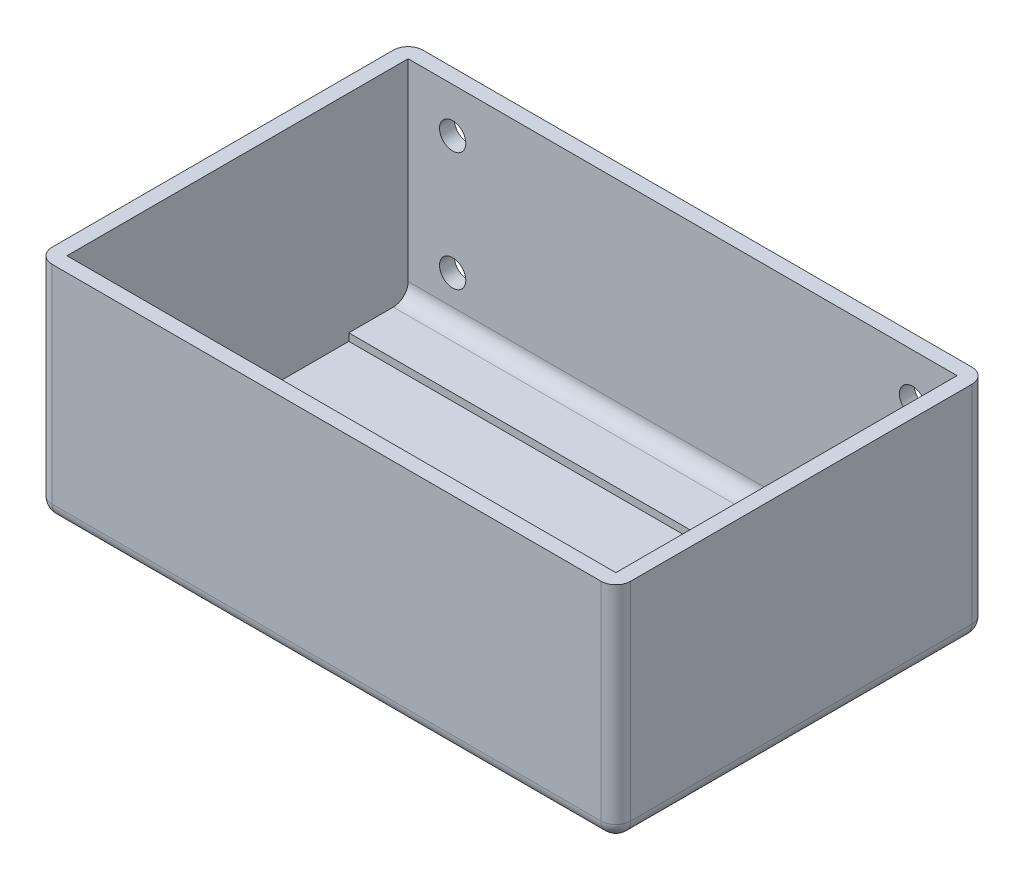
ISO-10303-21;
HEADER;
FILE_DESCRIPTION(('STEP AP214'),'2;1');
FILE_NAME('part.step','',(''),(''),'','','');
FILE_SCHEMA(('AUTOMOTIVE_DESIGN { 1 0 10303 214 1 1 1 1 }'));
ENDSEC;
DATA;
#1=APPLICATION_CONTEXT('core data for automotive mechanical design processes');
#2=APPLICATION_PROTOCOL_DEFINITION('international standard','automotive_design',2000,#1);
#3=PRODUCT_CONTEXT('',#1,'mechanical');
#4=PRODUCT('Part','Part','',(#3));
#5=PRODUCT_RELATED_PRODUCT_CATEGORY('part','',(#4));
#6=PRODUCT_DEFINITION_FORMATION('','',#4);
#7=PRODUCT_DEFINITION_CONTEXT('part definition',#1,'design');
#8=PRODUCT_DEFINITION('design','',#6,#7);
#9=PRODUCT_DEFINITION_SHAPE('','',#8);
#10=(LENGTH_UNIT() NAMED_UNIT(*) SI_UNIT(.MILLI.,.METRE.));
#11=(NAMED_UNIT(*) PLANE_ANGLE_UNIT() SI_UNIT($,.RADIAN.));
#12=(NAMED_UNIT(*) SI_UNIT($,.STERADIAN.) SOLID_ANGLE_UNIT());
#13=UNCERTAINTY_MEASURE_WITH_UNIT(LENGTH_MEASURE(1.E-05),#10,'distance_accuracy_value','');
#14=(GEOMETRIC_REPRESENTATION_CONTEXT(3) GLOBAL_UNCERTAINTY_ASSIGNED_CONTEXT((#13)) GLOBAL_UNIT_ASSIGNED_CONTEXT((#10,
#11,#12)) REPRESENTATION_CONTEXT('',''));
#15=CARTESIAN_POINT('',(0.,0.,0.));
#16=DIRECTION('',(0.,0.,1.));
#17=DIRECTION('',(1.,0.,0.));
#18=AXIS2_PLACEMENT_3D('',#15,#16,#17);
#19=CARTESIAN_POINT('',(48.26,38.1,29.21));
#20=DIRECTION('',(0.,0.,-1.));
#21=DIRECTION('',(0.,1.,0.));
#22=AXIS2_PLACEMENT_3D('',#19,#20,#21);
#23=PLANE('',#22);
#24=DIRECTION('',(0.,-1.,0.));
#25=VECTOR('',#24,1.);
#26=CARTESIAN_POINT('',(-45.72,38.1,29.21));
#27=LINE('',#26,#25);
#28=CARTESIAN_POINT('',(-45.72,38.1,29.21));
#29=VERTEX_POINT('',#28);
#30=CARTESIAN_POINT('',(-45.72,5.08,29.21));
#31=VERTEX_POINT('',#30);
#32=EDGE_CURVE('E493',#29,#31,#27,.T.);
#33=ORIENTED_EDGE('',*,*,#32,.F.);
#34=DIRECTION('',(-1.,0.,0.));
#35=VECTOR('',#34,1.);
#36=CARTESIAN_POINT('',(48.26,38.1,29.21));
#37=LINE('',#36,#35);
#38=CARTESIAN_POINT('',(48.26,38.1,29.21));
#39=VERTEX_POINT('',#38);
#40=EDGE_CURVE('E254',#39,#29,#37,.T.);
#41=ORIENTED_EDGE('',*,*,#40,.F.);
#42=DIRECTION('',(0.,-1.,0.));
#43=VECTOR('',#42,1.);
#44=CARTESIAN_POINT('',(48.26,38.1,29.21));
#45=LINE('',#44,#43);
#46=CARTESIAN_POINT('',(48.26,5.08,29.21));
#47=VERTEX_POINT('',#46);
#48=EDGE_CURVE('E395',#39,#47,#45,.T.);
#49=ORIENTED_EDGE('',*,*,#48,.T.);
#50=DIRECTION('',(-1.,0.,0.));
#51=VECTOR('',#50,1.);
#52=CARTESIAN_POINT('',(-48.26,5.07999999999999,29.21));
#53=LINE('',#52,#51);
#54=EDGE_CURVE('E258',#47,#31,#53,.T.);
#55=ORIENTED_EDGE('',*,*,#54,.T.);
#56=EDGE_LOOP('',(#33,#41,#49,#55));
#57=FACE_BOUND('',#56,.T.);
#58=ADVANCED_FACE('F47',(#57),#23,.T.);
#59=CARTESIAN_POINT('',(48.26,38.1,31.75));
#60=DIRECTION('',(0.,1.,0.));
#61=DIRECTION('',(0.,0.,1.));
#62=AXIS2_PLACEMENT_3D('',#59,#60,#61);
#63=PLANE('',#62);
#64=DIRECTION('',(-1.,0.,0.));
#65=VECTOR('',#64,1.);
#66=CARTESIAN_POINT('',(48.26,38.1,-29.21));
#67=LINE('',#66,#65);
#68=CARTESIAN_POINT('',(48.26,38.1,-29.21));
#69=VERTEX_POINT('',#68);
#70=CARTESIAN_POINT('',(-45.72,38.1,-29.21));
#71=VERTEX_POINT('',#70);
#72=EDGE_CURVE('E417',#69,#71,#67,.T.);
#73=ORIENTED_EDGE('',*,*,#72,.F.);
#74=DIRECTION('',(0.,0.,1.));
#75=VECTOR('',#74,1.);
#76=CARTESIAN_POINT('',(48.26,38.1,0.));
#77=LINE('',#76,#75);
#78=EDGE_CURVE('E536',#69,#39,#77,.T.);
#79=ORIENTED_EDGE('',*,*,#78,.T.);
#80=ORIENTED_EDGE('',*,*,#40,.T.);
#81=DIRECTION('',(0.,0.,-1.));
#82=VECTOR('',#81,1.);
#83=CARTESIAN_POINT('',(-45.72,38.1,0.));
#84=LINE('',#83,#82);
#85=EDGE_CURVE('E531',#29,#71,#84,.T.);
#86=ORIENTED_EDGE('',*,*,#85,.T.);
#87=EDGE_LOOP('',(#73,#79,#80,#86));
#88=FACE_BOUND('',#87,.T.);
#89=DIRECTION('',(-1.,0.,0.));
#90=VECTOR('',#89,1.);
#91=CARTESIAN_POINT('',(48.26,38.1,31.75));
#92=LINE('',#91,#90);
#93=CARTESIAN_POINT('',(48.26,38.1,31.75));
#94=VERTEX_POINT('',#93);
#95=CARTESIAN_POINT('',(-45.72,38.1,31.75));
#96=VERTEX_POINT('',#95);
#97=EDGE_CURVE('E411',#94,#96,#92,.T.);
#98=ORIENTED_EDGE('',*,*,#97,.F.);
#99=CARTESIAN_POINT('',(48.26,38.1,29.21));
#100=DIRECTION('',(0.,1.,0.));
#101=DIRECTION('',(0.,0.,1.));
#102=AXIS2_PLACEMENT_3D('',#99,#100,#101);
#103=CIRCLE('',#102,2.54);
#104=CARTESIAN_POINT('',(50.8,38.1,29.21));
#105=VERTEX_POINT('',#104);
#106=EDGE_CURVE('E342',#94,#105,#103,.T.);
#107=ORIENTED_EDGE('',*,*,#106,.T.);
#108=DIRECTION('',(0.,0.,1.));
#109=VECTOR('',#108,1.);
#110=CARTESIAN_POINT('',(50.8,38.1,0.));
#111=LINE('',#110,#109);
#112=CARTESIAN_POINT('',(50.8,38.1,-29.21));
#113=VERTEX_POINT('',#112);
#114=EDGE_CURVE('E535',#113,#105,#111,.T.);
#115=ORIENTED_EDGE('',*,*,#114,.F.);
#116=CARTESIAN_POINT('',(48.26,38.1,-29.21));
#117=DIRECTION('',(0.,1.,0.));
#118=DIRECTION('',(0.,0.,1.));
#119=AXIS2_PLACEMENT_3D('',#116,#117,#118);
#120=CIRCLE('',#119,2.54);
#121=CARTESIAN_POINT('',(48.26,38.1,-31.75));
#122=VERTEX_POINT('',#121);
#123=EDGE_CURVE('E71',#113,#122,#120,.T.);
#124=ORIENTED_EDGE('',*,*,#123,.T.);
#125=DIRECTION('',(-1.,0.,0.));
#126=VECTOR('',#125,1.);
#127=CARTESIAN_POINT('',(48.26,38.1,-31.75));
#128=LINE('',#127,#126);
#129=CARTESIAN_POINT('',(-45.72,38.1,-31.75));
#130=VERTEX_POINT('',#129);
#131=EDGE_CURVE('E390',#122,#130,#128,.T.);
#132=ORIENTED_EDGE('',*,*,#131,.T.);
#133=CARTESIAN_POINT('',(-45.72,38.1,-29.21));
#134=DIRECTION('',(0.,1.,0.));
#135=DIRECTION('',(0.,0.,1.));
#136=AXIS2_PLACEMENT_3D('',#133,#134,#135);
#137=CIRCLE('',#136,2.54);
#138=CARTESIAN_POINT('',(-48.26,38.1,-29.21));
#139=VERTEX_POINT('',#138);
#140=EDGE_CURVE('E334',#130,#139,#137,.T.);
#141=ORIENTED_EDGE('',*,*,#140,.T.);
#142=DIRECTION('',(0.,0.,-1.));
#143=VECTOR('',#142,1.);
#144=CARTESIAN_POINT('',(-48.26,38.1,31.75));
#145=LINE('',#144,#143);
#146=CARTESIAN_POINT('',(-48.26,38.1,29.21));
#147=VERTEX_POINT('',#146);
#148=EDGE_CURVE('E388',#147,#139,#145,.T.);
#149=ORIENTED_EDGE('',*,*,#148,.F.);
#150=CARTESIAN_POINT('',(-45.72,38.1,29.21));
#151=DIRECTION('',(0.,1.,0.));
#152=DIRECTION('',(0.,0.,1.));
#153=AXIS2_PLACEMENT_3D('',#150,#151,#152);
#154=CIRCLE('',#153,2.54);
#155=EDGE_CURVE('E337',#147,#96,#154,.T.);
#156=ORIENTED_EDGE('',*,*,#155,.T.);
#157=EDGE_LOOP('',(#98,#107,#115,#124,#132,#141,#149,#156));
#158=FACE_BOUND('',#157,.T.);
#159=ADVANCED_FACE('F387',(#88,#158),#63,.T.);
#160=CARTESIAN_POINT('',(48.26,0.,31.75));
#161=DIRECTION('',(0.,0.,1.));
#162=DIRECTION('',(1.,0.,0.));
#163=AXIS2_PLACEMENT_3D('',#160,#161,#162);
#164=PLANE('',#163);
#165=DIRECTION('',(-1.,0.,0.));
#166=VECTOR('',#165,1.);
#167=CARTESIAN_POINT('',(48.26,2.53999999999999,31.75));
#168=LINE('',#167,#166);
#169=CARTESIAN_POINT('',(-45.72,2.53999999999999,31.75));
#170=VERTEX_POINT('',#169);
#171=CARTESIAN_POINT('',(48.26,2.53999999999999,31.75));
#172=VERTEX_POINT('',#171);
#173=EDGE_CURVE('E281',#170,#172,#168,.F.);
#174=ORIENTED_EDGE('',*,*,#173,.T.);
#175=DIRECTION('',(0.,1.,0.));
#176=VECTOR('',#175,1.);
#177=CARTESIAN_POINT('',(48.26,0.,31.75));
#178=LINE('',#177,#176);
#179=EDGE_CURVE('E331',#172,#94,#178,.T.);
#180=ORIENTED_EDGE('',*,*,#179,.T.);
#181=ORIENTED_EDGE('',*,*,#97,.T.);
#182=DIRECTION('',(0.,1.,0.));
#183=VECTOR('',#182,1.);
#184=CARTESIAN_POINT('',(-45.72,2.53999999999999,31.75));
#185=LINE('',#184,#183);
#186=EDGE_CURVE('E328',#96,#170,#185,.F.);
#187=ORIENTED_EDGE('',*,*,#186,.T.);
#188=EDGE_LOOP('',(#174,#180,#181,#187));
#189=FACE_BOUND('',#188,.T.);
#190=ADVANCED_FACE('F603',(#189),#164,.T.);
#191=CARTESIAN_POINT('',(48.26,0.,-31.75));
#192=DIRECTION('',(0.,-1.,0.));
#193=DIRECTION('',(0.,0.,-1.));
#194=AXIS2_PLACEMENT_3D('',#191,#192,#193);
#195=PLANE('',#194);
#196=DIRECTION('',(-1.,0.,0.));
#197=VECTOR('',#196,1.);
#198=CARTESIAN_POINT('',(48.26,0.,-29.21));
#199=LINE('',#198,#197);
#200=CARTESIAN_POINT('',(-45.72,0.,-29.21));
#201=VERTEX_POINT('',#200);
#202=CARTESIAN_POINT('',(48.26,0.,-29.21));
#203=VERTEX_POINT('',#202);
#204=EDGE_CURVE('E277',#201,#203,#199,.F.);
#205=ORIENTED_EDGE('',*,*,#204,.T.);
#206=DIRECTION('',(0.,0.,-1.));
#207=VECTOR('',#206,1.);
#208=CARTESIAN_POINT('',(48.26,0.,-31.75));
#209=LINE('',#208,#207);
#210=CARTESIAN_POINT('',(48.26,0.,29.21));
#211=VERTEX_POINT('',#210);
#212=EDGE_CURVE('E310',#203,#211,#209,.F.);
#213=ORIENTED_EDGE('',*,*,#212,.T.);
#214=DIRECTION('',(-1.,0.,0.));
#215=VECTOR('',#214,1.);
#216=CARTESIAN_POINT('',(48.26,0.,29.21));
#217=LINE('',#216,#215);
#218=CARTESIAN_POINT('',(-45.72,0.,29.21));
#219=VERTEX_POINT('',#218);
#220=EDGE_CURVE('E273',#211,#219,#217,.T.);
#221=ORIENTED_EDGE('',*,*,#220,.T.);
#222=DIRECTION('',(0.,0.,1.));
#223=VECTOR('',#222,1.);
#224=CARTESIAN_POINT('',(-45.72,0.,-29.21));
#225=LINE('',#224,#223);
#226=EDGE_CURVE('E307',#219,#201,#225,.F.);
#227=ORIENTED_EDGE('',*,*,#226,.T.);
#228=EDGE_LOOP('',(#205,#213,#221,#227));
#229=FACE_BOUND('',#228,.T.);
#230=ADVANCED_FACE('F811',(#229),#195,.T.);
#231=CARTESIAN_POINT('',(48.26,0.,-31.75));
#232=DIRECTION('',(0.,0.,1.));
#233=DIRECTION('',(0.,-1.,0.));
#234=AXIS2_PLACEMENT_3D('',#231,#232,#233);
#235=PLANE('',#234);
#236=CARTESIAN_POINT('',(-38.1,30.48,-31.75));
#237=DIRECTION('',(0.,0.,1.));
#238=DIRECTION('',(1.,0.,0.));
#239=AXIS2_PLACEMENT_3D('',#236,#237,#238);
#240=CIRCLE('',#239,2.25);
#241=CARTESIAN_POINT('',(-35.85,30.48,-31.75));
#242=VERTEX_POINT('',#241);
#243=EDGE_CURVE('E561',#242,#242,#240,.T.);
#244=ORIENTED_EDGE('',*,*,#243,.T.);
#245=EDGE_LOOP('',(#244));
#246=FACE_BOUND('',#245,.T.);
#247=CARTESIAN_POINT('',(40.64,30.48,-31.75));
#248=DIRECTION('',(0.,0.,1.));
#249=DIRECTION('',(1.,0.,0.));
#250=AXIS2_PLACEMENT_3D('',#247,#248,#249);
#251=CIRCLE('',#250,2.25);
#252=CARTESIAN_POINT('',(42.89,30.48,-31.75));
#253=VERTEX_POINT('',#252);
#254=EDGE_CURVE('E553',#253,#253,#251,.T.);
#255=ORIENTED_EDGE('',*,*,#254,.T.);
#256=EDGE_LOOP('',(#255));
#257=FACE_BOUND('',#256,.T.);
#258=CARTESIAN_POINT('',(-38.1,10.16,-31.75));
#259=DIRECTION('',(0.,0.,1.));
#260=DIRECTION('',(1.,0.,0.));
#261=AXIS2_PLACEMENT_3D('',#258,#259,#260);
#262=CIRCLE('',#261,2.25);
#263=CARTESIAN_POINT('',(-35.85,10.16,-31.75));
#264=VERTEX_POINT('',#263);
#265=EDGE_CURVE('E366',#264,#264,#262,.T.);
#266=ORIENTED_EDGE('',*,*,#265,.T.);
#267=EDGE_LOOP('',(#266));
#268=FACE_BOUND('',#267,.T.);
#269=CARTESIAN_POINT('',(40.64,10.16,-31.75));
#270=DIRECTION('',(0.,0.,1.));
#271=DIRECTION('',(0.,-1.,0.));
#272=AXIS2_PLACEMENT_3D('',#269,#270,#271);
#273=CIRCLE('',#272,6.35);
#274=CARTESIAN_POINT('',(40.64,3.81,-31.75));
#275=VERTEX_POINT('',#274);
#276=EDGE_CURVE('E237',#275,#275,#273,.T.);
#277=ORIENTED_EDGE('',*,*,#276,.T.);
#278=EDGE_LOOP('',(#277));
#279=FACE_BOUND('',#278,.T.);
#280=ORIENTED_EDGE('',*,*,#131,.F.);
#281=DIRECTION('',(0.,1.,0.));
#282=VECTOR('',#281,1.);
#283=CARTESIAN_POINT('',(48.26,2.54,-31.75));
#284=LINE('',#283,#282);
#285=CARTESIAN_POINT('',(48.26,2.54,-31.75));
#286=VERTEX_POINT('',#285);
#287=EDGE_CURVE('E11',#122,#286,#284,.F.);
#288=ORIENTED_EDGE('',*,*,#287,.T.);
#289=DIRECTION('',(-1.,0.,0.));
#290=VECTOR('',#289,1.);
#291=CARTESIAN_POINT('',(-48.26,2.54,-31.75));
#292=LINE('',#291,#290);
#293=CARTESIAN_POINT('',(-45.72,2.54,-31.75));
#294=VERTEX_POINT('',#293);
#295=EDGE_CURVE('E268',#286,#294,#292,.T.);
#296=ORIENTED_EDGE('',*,*,#295,.T.);
#297=DIRECTION('',(0.,1.,0.));
#298=VECTOR('',#297,1.);
#299=CARTESIAN_POINT('',(-45.72,0.,-31.75));
#300=LINE('',#299,#298);
#301=EDGE_CURVE('E57',#294,#130,#300,.T.);
#302=ORIENTED_EDGE('',*,*,#301,.T.);
#303=EDGE_LOOP('',(#280,#288,#296,#302));
#304=FACE_BOUND('',#303,.T.);
#305=ADVANCED_FACE('F575',(#246,#257,#268,#279,#304),#235,.F.);
#306=CARTESIAN_POINT('',(48.26,38.1,-29.21));
#307=DIRECTION('',(0.,0.,-1.));
#308=DIRECTION('',(0.,1.,0.));
#309=AXIS2_PLACEMENT_3D('',#306,#307,#308);
#310=PLANE('',#309);
#311=CARTESIAN_POINT('',(-38.1,30.48,-29.21));
#312=DIRECTION('',(0.,0.,1.));
#313=DIRECTION('',(1.,0.,0.));
#314=AXIS2_PLACEMENT_3D('',#311,#312,#313);
#315=CIRCLE('',#314,2.25);
#316=CARTESIAN_POINT('',(-35.85,30.48,-29.21));
#317=VERTEX_POINT('',#316);
#318=EDGE_CURVE('E565',#317,#317,#315,.T.);
#319=ORIENTED_EDGE('',*,*,#318,.F.);
#320=EDGE_LOOP('',(#319));
#321=FACE_BOUND('',#320,.T.);
#322=CARTESIAN_POINT('',(40.64,30.48,-29.21));
#323=DIRECTION('',(0.,0.,1.));
#324=DIRECTION('',(1.,0.,0.));
#325=AXIS2_PLACEMENT_3D('',#322,#323,#324);
#326=CIRCLE('',#325,2.25);
#327=CARTESIAN_POINT('',(42.89,30.48,-29.21));
#328=VERTEX_POINT('',#327);
#329=EDGE_CURVE('E557',#328,#328,#326,.T.);
#330=ORIENTED_EDGE('',*,*,#329,.F.);
#331=EDGE_LOOP('',(#330));
#332=FACE_BOUND('',#331,.T.);
#333=CARTESIAN_POINT('',(-38.1,10.16,-29.21));
#334=DIRECTION('',(0.,0.,1.));
#335=DIRECTION('',(1.,0.,0.));
#336=AXIS2_PLACEMENT_3D('',#333,#334,#335);
#337=CIRCLE('',#336,2.25);
#338=CARTESIAN_POINT('',(-35.85,10.16,-29.21));
#339=VERTEX_POINT('',#338);
#340=EDGE_CURVE('E549',#339,#339,#337,.T.);
#341=ORIENTED_EDGE('',*,*,#340,.F.);
#342=EDGE_LOOP('',(#341));
#343=FACE_BOUND('',#342,.T.);
#344=CARTESIAN_POINT('',(40.64,10.16,-29.21));
#345=DIRECTION('',(0.,0.,-1.));
#346=DIRECTION('',(0.,1.,0.));
#347=AXIS2_PLACEMENT_3D('',#344,#345,#346);
#348=CIRCLE('',#347,6.35);
#349=CARTESIAN_POINT('',(36.83,5.08,-29.21));
#350=VERTEX_POINT('',#349);
#351=CARTESIAN_POINT('',(44.45,5.08,-29.21));
#352=VERTEX_POINT('',#351);
#353=EDGE_CURVE('E235',#350,#352,#348,.T.);
#354=ORIENTED_EDGE('',*,*,#353,.T.);
#355=DIRECTION('',(-1.,0.,0.));
#356=VECTOR('',#355,1.);
#357=CARTESIAN_POINT('',(48.26,5.08,-29.21));
#358=LINE('',#357,#356);
#359=CARTESIAN_POINT('',(48.26,5.08000000000001,-29.21));
#360=VERTEX_POINT('',#359);
#361=EDGE_CURVE('E230',#352,#360,#358,.F.);
#362=ORIENTED_EDGE('',*,*,#361,.T.);
#363=DIRECTION('',(0.,-1.,0.));
#364=VECTOR('',#363,1.);
#365=CARTESIAN_POINT('',(48.26,38.1,-29.21));
#366=LINE('',#365,#364);
#367=EDGE_CURVE('E406',#69,#360,#366,.T.);
#368=ORIENTED_EDGE('',*,*,#367,.F.);
#369=ORIENTED_EDGE('',*,*,#72,.T.);
#370=DIRECTION('',(0.,-1.,0.));
#371=VECTOR('',#370,1.);
#372=CARTESIAN_POINT('',(-45.72,38.1,-29.21));
#373=LINE('',#372,#371);
#374=CARTESIAN_POINT('',(-45.72,5.08,-29.21));
#375=VERTEX_POINT('',#374);
#376=EDGE_CURVE('E396',#71,#375,#373,.T.);
#377=ORIENTED_EDGE('',*,*,#376,.T.);
#378=EDGE_CURVE('E229',#375,#350,#358,.F.);
#379=ORIENTED_EDGE('',*,*,#378,.T.);
#380=EDGE_LOOP('',(#354,#362,#368,#369,#377,#379));
#381=FACE_BOUND('',#380,.T.);
#382=ADVANCED_FACE('F240',(#321,#332,#343,#381),#310,.F.);
#383=CARTESIAN_POINT('',(48.26,2.54,-29.21));
#384=DIRECTION('',(0.,-1.,0.));
#385=DIRECTION('',(0.,0.,-1.));
#386=AXIS2_PLACEMENT_3D('',#383,#384,#385);
#387=PLANE('',#386);
#388=DIRECTION('',(-1.,0.,0.));
#389=VECTOR('',#388,1.);
#390=CARTESIAN_POINT('',(-48.26,2.54,-26.67));
#391=LINE('',#390,#389);
#392=CARTESIAN_POINT('',(48.26,2.54,-26.67));
#393=VERTEX_POINT('',#392);
#394=CARTESIAN_POINT('',(-45.72,2.54,-26.67));
#395=VERTEX_POINT('',#394);
#396=EDGE_CURVE('E251',#393,#395,#391,.T.);
#397=ORIENTED_EDGE('',*,*,#396,.T.);
#398=DIRECTION('',(0.,0.,1.));
#399=VECTOR('',#398,1.);
#400=CARTESIAN_POINT('',(-45.72,2.54,-29.21));
#401=LINE('',#400,#399);
#402=CARTESIAN_POINT('',(-45.72,2.54,-19.05));
#403=VERTEX_POINT('',#402);
#404=EDGE_CURVE('E496',#395,#403,#401,.T.);
#405=ORIENTED_EDGE('',*,*,#404,.T.);
#406=DIRECTION('',(-1.,0.,0.));
#407=VECTOR('',#406,1.);
#408=CARTESIAN_POINT('',(48.26,2.54,-19.05));
#409=LINE('',#408,#407);
#410=CARTESIAN_POINT('',(48.26,2.54,-19.05));
#411=VERTEX_POINT('',#410);
#412=EDGE_CURVE('E421',#411,#403,#409,.T.);
#413=ORIENTED_EDGE('',*,*,#412,.F.);
#414=DIRECTION('',(0.,0.,1.));
#415=VECTOR('',#414,1.);
#416=CARTESIAN_POINT('',(48.26,2.54,-29.21));
#417=LINE('',#416,#415);
#418=EDGE_CURVE('E457',#393,#411,#417,.T.);
#419=ORIENTED_EDGE('',*,*,#418,.F.);
#420=EDGE_LOOP('',(#397,#405,#413,#419));
#421=FACE_BOUND('',#420,.T.);
#422=ADVANCED_FACE('F574',(#421),#387,.F.);
#423=CARTESIAN_POINT('',(48.26,2.54,-19.05));
#424=DIRECTION('',(0.,0.,-1.));
#425=DIRECTION('',(-1.,0.,0.));
#426=AXIS2_PLACEMENT_3D('',#423,#424,#425);
#427=PLANE('',#426);
#428=ORIENTED_EDGE('',*,*,#412,.T.);
#429=DIRECTION('',(0.,-1.,0.));
#430=VECTOR('',#429,1.);
#431=CARTESIAN_POINT('',(-45.72,2.54,-19.05));
#432=LINE('',#431,#430);
#433=CARTESIAN_POINT('',(-45.72,1.27,-19.05));
#434=VERTEX_POINT('',#433);
#435=EDGE_CURVE('E500',#403,#434,#432,.T.);
#436=ORIENTED_EDGE('',*,*,#435,.T.);
#437=DIRECTION('',(-1.,0.,0.));
#438=VECTOR('',#437,1.);
#439=CARTESIAN_POINT('',(48.26,1.27,-19.05));
#440=LINE('',#439,#438);
#441=CARTESIAN_POINT('',(48.26,1.27,-19.05));
#442=VERTEX_POINT('',#441);
#443=EDGE_CURVE('E425',#442,#434,#440,.T.);
#444=ORIENTED_EDGE('',*,*,#443,.F.);
#445=DIRECTION('',(0.,-1.,0.));
#446=VECTOR('',#445,1.);
#447=CARTESIAN_POINT('',(48.26,2.54,-19.05));
#448=LINE('',#447,#446);
#449=EDGE_CURVE('E460',#411,#442,#448,.T.);
#450=ORIENTED_EDGE('',*,*,#449,.F.);
#451=EDGE_LOOP('',(#428,#436,#444,#450));
#452=FACE_BOUND('',#451,.T.);
#453=ADVANCED_FACE('F785',(#452),#427,.F.);
#454=CARTESIAN_POINT('',(48.26,1.27,-19.05));
#455=DIRECTION('',(0.,-1.,0.));
#456=DIRECTION('',(0.,0.,-1.));
#457=AXIS2_PLACEMENT_3D('',#454,#455,#456);
#458=PLANE('',#457);
#459=ORIENTED_EDGE('',*,*,#443,.T.);
#460=DIRECTION('',(0.,0.,1.));
#461=VECTOR('',#460,1.);
#462=CARTESIAN_POINT('',(-45.72,1.27,-19.05));
#463=LINE('',#462,#461);
#464=CARTESIAN_POINT('',(-45.72,1.26999999999999,-6.35));
#465=VERTEX_POINT('',#464);
#466=EDGE_CURVE('E504',#434,#465,#463,.T.);
#467=ORIENTED_EDGE('',*,*,#466,.T.);
#468=DIRECTION('',(-1.,0.,0.));
#469=VECTOR('',#468,1.);
#470=CARTESIAN_POINT('',(48.26,1.26999999999999,-6.35));
#471=LINE('',#470,#469);
#472=CARTESIAN_POINT('',(48.26,1.26999999999999,-6.35));
#473=VERTEX_POINT('',#472);
#474=EDGE_CURVE('E429',#473,#465,#471,.T.);
#475=ORIENTED_EDGE('',*,*,#474,.F.);
#476=DIRECTION('',(0.,0.,1.));
#477=VECTOR('',#476,1.);
#478=CARTESIAN_POINT('',(48.26,1.27,-19.05));
#479=LINE('',#478,#477);
#480=EDGE_CURVE('E464',#442,#473,#479,.T.);
#481=ORIENTED_EDGE('',*,*,#480,.F.);
#482=EDGE_LOOP('',(#459,#467,#475,#481));
#483=FACE_BOUND('',#482,.T.);
#484=ADVANCED_FACE('F777',(#483),#458,.F.);
#485=CARTESIAN_POINT('',(48.26,1.26999999999999,-6.35));
#486=DIRECTION('',(0.,0.,1.));
#487=DIRECTION('',(0.,-1.,0.));
#488=AXIS2_PLACEMENT_3D('',#485,#486,#487);
#489=PLANE('',#488);
#490=ORIENTED_EDGE('',*,*,#474,.T.);
#491=DIRECTION('',(0.,1.,0.));
#492=VECTOR('',#491,1.);
#493=CARTESIAN_POINT('',(-45.72,1.26999999999999,-6.35));
#494=LINE('',#493,#492);
#495=CARTESIAN_POINT('',(-45.72,2.54,-6.35));
#496=VERTEX_POINT('',#495);
#497=EDGE_CURVE('E508',#465,#496,#494,.T.);
#498=ORIENTED_EDGE('',*,*,#497,.T.);
#499=DIRECTION('',(-1.,0.,0.));
#500=VECTOR('',#499,1.);
#501=CARTESIAN_POINT('',(48.26,2.54,-6.35));
#502=LINE('',#501,#500);
#503=CARTESIAN_POINT('',(48.26,2.54,-6.35));
#504=VERTEX_POINT('',#503);
#505=EDGE_CURVE('E433',#504,#496,#502,.T.);
#506=ORIENTED_EDGE('',*,*,#505,.F.);
#507=DIRECTION('',(0.,1.,0.));
#508=VECTOR('',#507,1.);
#509=CARTESIAN_POINT('',(48.26,1.26999999999999,-6.35));
#510=LINE('',#509,#508);
#511=EDGE_CURVE('E469',#473,#504,#510,.T.);
#512=ORIENTED_EDGE('',*,*,#511,.F.);
#513=EDGE_LOOP('',(#490,#498,#506,#512));
#514=FACE_BOUND('',#513,.T.);
#515=ADVANCED_FACE('F769',(#514),#489,.F.);
#516=CARTESIAN_POINT('',(48.26,2.53999999999999,6.35));
#517=DIRECTION('',(0.,1.,0.));
#518=DIRECTION('',(0.,0.,1.));
#519=AXIS2_PLACEMENT_3D('',#516,#517,#518);
#520=PLANE('',#519);
#521=DIRECTION('',(0.,0.,-1.));
#522=VECTOR('',#521,1.);
#523=CARTESIAN_POINT('',(-45.72,2.53999999999999,6.35));
#524=LINE('',#523,#522);
#525=CARTESIAN_POINT('',(-45.72,2.53999999999999,6.35));
#526=VERTEX_POINT('',#525);
#527=EDGE_CURVE('E512',#526,#496,#524,.T.);
#528=ORIENTED_EDGE('',*,*,#527,.F.);
#529=DIRECTION('',(-1.,0.,0.));
#530=VECTOR('',#529,1.);
#531=CARTESIAN_POINT('',(48.26,2.53999999999999,6.35));
#532=LINE('',#531,#530);
#533=CARTESIAN_POINT('',(48.26,2.53999999999999,6.35));
#534=VERTEX_POINT('',#533);
#535=EDGE_CURVE('E437',#534,#526,#532,.T.);
#536=ORIENTED_EDGE('',*,*,#535,.F.);
#537=DIRECTION('',(0.,0.,-1.));
#538=VECTOR('',#537,1.);
#539=CARTESIAN_POINT('',(48.26,2.53999999999999,6.35));
#540=LINE('',#539,#538);
#541=EDGE_CURVE('E472',#534,#504,#540,.T.);
#542=ORIENTED_EDGE('',*,*,#541,.T.);
#543=ORIENTED_EDGE('',*,*,#505,.T.);
#544=EDGE_LOOP('',(#528,#536,#542,#543));
#545=FACE_BOUND('',#544,.T.);
#546=ADVANCED_FACE('F761',(#545),#520,.T.);
#547=CARTESIAN_POINT('',(48.26,1.26999999999999,6.35));
#548=DIRECTION('',(0.,0.,1.));
#549=DIRECTION('',(0.,-1.,0.));
#550=AXIS2_PLACEMENT_3D('',#547,#548,#549);
#551=PLANE('',#550);
#552=DIRECTION('',(0.,1.,0.));
#553=VECTOR('',#552,1.);
#554=CARTESIAN_POINT('',(-45.72,1.26999999999999,6.35));
#555=LINE('',#554,#553);
#556=CARTESIAN_POINT('',(-45.72,1.26999999999999,6.35));
#557=VERTEX_POINT('',#556);
#558=EDGE_CURVE('E515',#557,#526,#555,.T.);
#559=ORIENTED_EDGE('',*,*,#558,.F.);
#560=DIRECTION('',(-1.,0.,0.));
#561=VECTOR('',#560,1.);
#562=CARTESIAN_POINT('',(48.26,1.26999999999999,6.35));
#563=LINE('',#562,#561);
#564=CARTESIAN_POINT('',(48.26,1.26999999999999,6.35));
#565=VERTEX_POINT('',#564);
#566=EDGE_CURVE('E441',#565,#557,#563,.T.);
#567=ORIENTED_EDGE('',*,*,#566,.F.);
#568=DIRECTION('',(0.,1.,0.));
#569=VECTOR('',#568,1.);
#570=CARTESIAN_POINT('',(48.26,1.26999999999999,6.35));
#571=LINE('',#570,#569);
#572=EDGE_CURVE('E476',#565,#534,#571,.T.);
#573=ORIENTED_EDGE('',*,*,#572,.T.);
#574=ORIENTED_EDGE('',*,*,#535,.T.);
#575=EDGE_LOOP('',(#559,#567,#573,#574));
#576=FACE_BOUND('',#575,.T.);
#577=ADVANCED_FACE('F753',(#576),#551,.T.);
#578=CARTESIAN_POINT('',(48.26,1.26999999999999,19.05));
#579=DIRECTION('',(0.,1.,0.));
#580=DIRECTION('',(0.,0.,1.));
#581=AXIS2_PLACEMENT_3D('',#578,#579,#580);
#582=PLANE('',#581);
#583=DIRECTION('',(0.,0.,-1.));
#584=VECTOR('',#583,1.);
#585=CARTESIAN_POINT('',(-45.72,1.26999999999999,19.05));
#586=LINE('',#585,#584);
#587=CARTESIAN_POINT('',(-45.72,1.26999999999999,19.05));
#588=VERTEX_POINT('',#587);
#589=EDGE_CURVE('E518',#588,#557,#586,.T.);
#590=ORIENTED_EDGE('',*,*,#589,.F.);
#591=DIRECTION('',(-1.,0.,0.));
#592=VECTOR('',#591,1.);
#593=CARTESIAN_POINT('',(48.26,1.26999999999999,19.05));
#594=LINE('',#593,#592);
#595=CARTESIAN_POINT('',(48.26,1.26999999999999,19.05));
#596=VERTEX_POINT('',#595);
#597=EDGE_CURVE('E445',#596,#588,#594,.T.);
#598=ORIENTED_EDGE('',*,*,#597,.F.);
#599=DIRECTION('',(0.,0.,-1.));
#600=VECTOR('',#599,1.);
#601=CARTESIAN_POINT('',(48.26,1.26999999999999,19.05));
#602=LINE('',#601,#600);
#603=EDGE_CURVE('E480',#596,#565,#602,.T.);
#604=ORIENTED_EDGE('',*,*,#603,.T.);
#605=ORIENTED_EDGE('',*,*,#566,.T.);
#606=EDGE_LOOP('',(#590,#598,#604,#605));
#607=FACE_BOUND('',#606,.T.);
#608=ADVANCED_FACE('F746',(#607),#582,.T.);
#609=CARTESIAN_POINT('',(48.26,2.53999999999999,19.05));
#610=DIRECTION('',(0.,0.,-1.));
#611=DIRECTION('',(-1.,0.,0.));
#612=AXIS2_PLACEMENT_3D('',#609,#610,#611);
#613=PLANE('',#612);
#614=DIRECTION('',(0.,-1.,0.));
#615=VECTOR('',#614,1.);
#616=CARTESIAN_POINT('',(-45.72,2.53999999999999,19.05));
#617=LINE('',#616,#615);
#618=CARTESIAN_POINT('',(-45.72,2.53999999999999,19.05));
#619=VERTEX_POINT('',#618);
#620=EDGE_CURVE('E521',#619,#588,#617,.T.);
#621=ORIENTED_EDGE('',*,*,#620,.F.);
#622=DIRECTION('',(-1.,0.,0.));
#623=VECTOR('',#622,1.);
#624=CARTESIAN_POINT('',(48.26,2.53999999999999,19.05));
#625=LINE('',#624,#623);
#626=CARTESIAN_POINT('',(48.26,2.53999999999999,19.05));
#627=VERTEX_POINT('',#626);
#628=EDGE_CURVE('E449',#627,#619,#625,.T.);
#629=ORIENTED_EDGE('',*,*,#628,.F.);
#630=DIRECTION('',(0.,-1.,0.));
#631=VECTOR('',#630,1.);
#632=CARTESIAN_POINT('',(48.26,2.53999999999999,19.05));
#633=LINE('',#632,#631);
#634=EDGE_CURVE('E484',#627,#596,#633,.T.);
#635=ORIENTED_EDGE('',*,*,#634,.T.);
#636=ORIENTED_EDGE('',*,*,#597,.T.);
#637=EDGE_LOOP('',(#621,#629,#635,#636));
#638=FACE_BOUND('',#637,.T.);
#639=ADVANCED_FACE('F740',(#638),#613,.T.);
#640=CARTESIAN_POINT('',(48.26,2.53999999999999,29.21));
#641=DIRECTION('',(0.,1.,0.));
#642=DIRECTION('',(0.,0.,1.));
#643=AXIS2_PLACEMENT_3D('',#640,#641,#642);
#644=PLANE('',#643);
#645=DIRECTION('',(0.,0.,-1.));
#646=VECTOR('',#645,1.);
#647=CARTESIAN_POINT('',(-45.72,2.53999999999999,29.21));
#648=LINE('',#647,#646);
#649=CARTESIAN_POINT('',(-45.72,2.53999999999999,26.67));
#650=VERTEX_POINT('',#649);
#651=EDGE_CURVE('E524',#650,#619,#648,.T.);
#652=ORIENTED_EDGE('',*,*,#651,.F.);
#653=DIRECTION('',(-1.,0.,0.));
#654=VECTOR('',#653,1.);
#655=CARTESIAN_POINT('',(48.26,2.53999999999999,26.67));
#656=LINE('',#655,#654);
#657=CARTESIAN_POINT('',(48.26,2.53999999999999,26.67));
#658=VERTEX_POINT('',#657);
#659=EDGE_CURVE('E261',#650,#658,#656,.F.);
#660=ORIENTED_EDGE('',*,*,#659,.T.);
#661=DIRECTION('',(0.,0.,-1.));
#662=VECTOR('',#661,1.);
#663=CARTESIAN_POINT('',(48.26,2.53999999999999,29.21));
#664=LINE('',#663,#662);
#665=EDGE_CURVE('E400',#658,#627,#664,.T.);
#666=ORIENTED_EDGE('',*,*,#665,.T.);
#667=ORIENTED_EDGE('',*,*,#628,.T.);
#668=EDGE_LOOP('',(#652,#660,#666,#667));
#669=FACE_BOUND('',#668,.T.);
#670=ADVANCED_FACE('F608',(#669),#644,.T.);
#671=CARTESIAN_POINT('',(-48.26,0.,0.));
#672=DIRECTION('',(1.,0.,0.));
#673=DIRECTION('',(0.,0.,-1.));
#674=AXIS2_PLACEMENT_3D('',#671,#672,#673);
#675=PLANE('',#674);
#676=DIRECTION('',(0.,0.,1.));
#677=VECTOR('',#676,1.);
#678=CARTESIAN_POINT('',(-48.26,2.53999999999999,29.21));
#679=LINE('',#678,#677);
#680=CARTESIAN_POINT('',(-48.26,2.54,-29.21));
#681=VERTEX_POINT('',#680);
#682=CARTESIAN_POINT('',(-48.26,2.53999999999999,29.21));
#683=VERTEX_POINT('',#682);
#684=EDGE_CURVE('E322',#681,#683,#679,.T.);
#685=ORIENTED_EDGE('',*,*,#684,.T.);
#686=DIRECTION('',(0.,1.,0.));
#687=VECTOR('',#686,1.);
#688=CARTESIAN_POINT('',(-48.26,38.1,29.21));
#689=LINE('',#688,#687);
#690=EDGE_CURVE('E325',#683,#147,#689,.T.);
#691=ORIENTED_EDGE('',*,*,#690,.T.);
#692=ORIENTED_EDGE('',*,*,#148,.T.);
#693=DIRECTION('',(0.,1.,0.));
#694=VECTOR('',#693,1.);
#695=CARTESIAN_POINT('',(-48.26,0.,-29.21));
#696=LINE('',#695,#694);
#697=EDGE_CURVE('E319',#139,#681,#696,.F.);
#698=ORIENTED_EDGE('',*,*,#697,.T.);
#699=EDGE_LOOP('',(#685,#691,#692,#698));
#700=FACE_BOUND('',#699,.T.);
#701=ADVANCED_FACE('F392',(#700),#675,.F.);
#702=CARTESIAN_POINT('',(48.26,5.08,-26.67));
#703=DIRECTION('',(1.,0.,0.));
#704=DIRECTION('',(0.,0.,-1.));
#705=AXIS2_PLACEMENT_3D('',#702,#703,#704);
#706=CYLINDRICAL_SURFACE('',#705,2.54);
#707=ORIENTED_EDGE('',*,*,#378,.F.);
#708=CARTESIAN_POINT('',(-45.72,5.08,-26.67));
#709=DIRECTION('',(1.,0.,0.));
#710=DIRECTION('',(0.,0.,-1.));
#711=AXIS2_PLACEMENT_3D('',#708,#709,#710);
#712=CIRCLE('',#711,2.54);
#713=EDGE_CURVE('E402',#375,#395,#712,.F.);
#714=ORIENTED_EDGE('',*,*,#713,.T.);
#715=ORIENTED_EDGE('',*,*,#396,.F.);
#716=CARTESIAN_POINT('',(48.26,5.08,-26.67));
#717=DIRECTION('',(1.,0.,0.));
#718=DIRECTION('',(0.,0.,-1.));
#719=AXIS2_PLACEMENT_3D('',#716,#717,#718);
#720=CIRCLE('',#719,2.54);
#721=EDGE_CURVE('E249',#360,#393,#720,.F.);
#722=ORIENTED_EDGE('',*,*,#721,.F.);
#723=ORIENTED_EDGE('',*,*,#361,.F.);
#724=EDGE_CURVE('E219',#350,#352,#358,.F.);
#725=ORIENTED_EDGE('',*,*,#724,.F.);
#726=EDGE_LOOP('',(#707,#714,#715,#722,#723,#725));
#727=FACE_BOUND('',#726,.T.);
#728=ADVANCED_FACE('F247',(#727),#706,.F.);
#729=CARTESIAN_POINT('',(48.26,5.07999999999999,26.67));
#730=DIRECTION('',(1.,0.,0.));
#731=DIRECTION('',(0.,0.,-1.));
#732=AXIS2_PLACEMENT_3D('',#729,#730,#731);
#733=CYLINDRICAL_SURFACE('',#732,2.54);
#734=ORIENTED_EDGE('',*,*,#659,.F.);
#735=CARTESIAN_POINT('',(-45.72,5.07999999999999,26.67));
#736=DIRECTION('',(1.,0.,0.));
#737=DIRECTION('',(0.,0.,-1.));
#738=AXIS2_PLACEMENT_3D('',#735,#736,#737);
#739=CIRCLE('',#738,2.54);
#740=EDGE_CURVE('E527',#650,#31,#739,.F.);
#741=ORIENTED_EDGE('',*,*,#740,.T.);
#742=ORIENTED_EDGE('',*,*,#54,.F.);
#743=CARTESIAN_POINT('',(48.26,5.07999999999999,26.67));
#744=DIRECTION('',(1.,0.,0.));
#745=DIRECTION('',(0.,0.,-1.));
#746=AXIS2_PLACEMENT_3D('',#743,#744,#745);
#747=CIRCLE('',#746,2.54);
#748=EDGE_CURVE('E287',#658,#47,#747,.F.);
#749=ORIENTED_EDGE('',*,*,#748,.F.);
#750=EDGE_LOOP('',(#734,#741,#742,#749));
#751=FACE_BOUND('',#750,.T.);
#752=ADVANCED_FACE('F612',(#751),#733,.F.);
#753=CARTESIAN_POINT('',(48.26,2.54,-29.21));
#754=DIRECTION('',(1.,0.,0.));
#755=DIRECTION('',(0.,0.,-1.));
#756=AXIS2_PLACEMENT_3D('',#753,#754,#755);
#757=CYLINDRICAL_SURFACE('',#756,2.54);
#758=ORIENTED_EDGE('',*,*,#295,.F.);
#759=CARTESIAN_POINT('',(48.26,2.54,-29.21));
#760=DIRECTION('',(1.,0.,0.));
#761=DIRECTION('',(0.,0.,-1.));
#762=AXIS2_PLACEMENT_3D('',#759,#760,#761);
#763=CIRCLE('',#762,2.54);
#764=EDGE_CURVE('E316',#286,#203,#763,.F.);
#765=ORIENTED_EDGE('',*,*,#764,.T.);
#766=ORIENTED_EDGE('',*,*,#204,.F.);
#767=CARTESIAN_POINT('',(-45.72,2.54,-29.21));
#768=DIRECTION('',(1.,0.,0.));
#769=DIRECTION('',(0.,0.,-1.));
#770=AXIS2_PLACEMENT_3D('',#767,#768,#769);
#771=CIRCLE('',#770,2.54);
#772=EDGE_CURVE('E313',#201,#294,#771,.T.);
#773=ORIENTED_EDGE('',*,*,#772,.T.);
#774=EDGE_LOOP('',(#758,#765,#766,#773));
#775=FACE_BOUND('',#774,.T.);
#776=ADVANCED_FACE('F615',(#775),#757,.T.);
#777=CARTESIAN_POINT('',(48.26,2.53999999999999,29.21));
#778=DIRECTION('',(-1.,0.,0.));
#779=DIRECTION('',(0.,0.,1.));
#780=AXIS2_PLACEMENT_3D('',#777,#778,#779);
#781=CYLINDRICAL_SURFACE('',#780,2.54);
#782=ORIENTED_EDGE('',*,*,#220,.F.);
#783=CARTESIAN_POINT('',(48.26,2.53999999999999,29.21));
#784=DIRECTION('',(-1.,0.,0.));
#785=DIRECTION('',(0.,0.,1.));
#786=AXIS2_PLACEMENT_3D('',#783,#784,#785);
#787=CIRCLE('',#786,2.54);
#788=EDGE_CURVE('E294',#211,#172,#787,.T.);
#789=ORIENTED_EDGE('',*,*,#788,.T.);
#790=ORIENTED_EDGE('',*,*,#173,.F.);
#791=CARTESIAN_POINT('',(-45.72,2.53999999999999,29.21));
#792=DIRECTION('',(-1.,0.,0.));
#793=DIRECTION('',(0.,0.,1.));
#794=AXIS2_PLACEMENT_3D('',#791,#792,#793);
#795=CIRCLE('',#794,2.54);
#796=EDGE_CURVE('E290',#170,#219,#795,.F.);
#797=ORIENTED_EDGE('',*,*,#796,.T.);
#798=EDGE_LOOP('',(#782,#789,#790,#797));
#799=FACE_BOUND('',#798,.T.);
#800=ADVANCED_FACE('F619',(#799),#781,.T.);
#801=CARTESIAN_POINT('',(-45.72,2.54,-29.21));
#802=DIRECTION('',(1.,0.,0.));
#803=DIRECTION('',(0.,0.,-1.));
#804=AXIS2_PLACEMENT_3D('',#801,#802,#803);
#805=PLANE('',#804);
#806=ORIENTED_EDGE('',*,*,#376,.F.);
#807=ORIENTED_EDGE('',*,*,#85,.F.);
#808=ORIENTED_EDGE('',*,*,#32,.T.);
#809=ORIENTED_EDGE('',*,*,#740,.F.);
#810=ORIENTED_EDGE('',*,*,#651,.T.);
#811=ORIENTED_EDGE('',*,*,#620,.T.);
#812=ORIENTED_EDGE('',*,*,#589,.T.);
#813=ORIENTED_EDGE('',*,*,#558,.T.);
#814=ORIENTED_EDGE('',*,*,#527,.T.);
#815=ORIENTED_EDGE('',*,*,#497,.F.);
#816=ORIENTED_EDGE('',*,*,#466,.F.);
#817=ORIENTED_EDGE('',*,*,#435,.F.);
#818=ORIENTED_EDGE('',*,*,#404,.F.);
#819=ORIENTED_EDGE('',*,*,#713,.F.);
#820=EDGE_LOOP('',(#806,#807,#808,#809,#810,#811,#812,#813,#814,#815,#816,#817,#818,#819));
#821=FACE_BOUND('',#820,.T.);
#822=ADVANCED_FACE('F623',(#821),#805,.T.);
#823=CARTESIAN_POINT('',(48.26,2.54,-29.21));
#824=DIRECTION('',(1.,0.,0.));
#825=DIRECTION('',(0.,0.,-1.));
#826=AXIS2_PLACEMENT_3D('',#823,#824,#825);
#827=PLANE('',#826);
#828=ORIENTED_EDGE('',*,*,#78,.F.);
#829=ORIENTED_EDGE('',*,*,#367,.T.);
#830=ORIENTED_EDGE('',*,*,#721,.T.);
#831=ORIENTED_EDGE('',*,*,#418,.T.);
#832=ORIENTED_EDGE('',*,*,#449,.T.);
#833=ORIENTED_EDGE('',*,*,#480,.T.);
#834=ORIENTED_EDGE('',*,*,#511,.T.);
#835=ORIENTED_EDGE('',*,*,#541,.F.);
#836=ORIENTED_EDGE('',*,*,#572,.F.);
#837=ORIENTED_EDGE('',*,*,#603,.F.);
#838=ORIENTED_EDGE('',*,*,#634,.F.);
#839=ORIENTED_EDGE('',*,*,#665,.F.);
#840=ORIENTED_EDGE('',*,*,#748,.T.);
#841=ORIENTED_EDGE('',*,*,#48,.F.);
#842=EDGE_LOOP('',(#828,#829,#830,#831,#832,#833,#834,#835,#836,#837,#838,#839,#840,#841));
#843=FACE_BOUND('',#842,.T.);
#844=ADVANCED_FACE('F698',(#843),#827,.F.);
#845=CARTESIAN_POINT('',(50.8,2.54,-29.21));
#846=DIRECTION('',(1.,0.,0.));
#847=DIRECTION('',(0.,0.,-1.));
#848=AXIS2_PLACEMENT_3D('',#845,#846,#847);
#849=PLANE('',#848);
#850=ORIENTED_EDGE('',*,*,#114,.T.);
#851=DIRECTION('',(0.,1.,0.));
#852=VECTOR('',#851,1.);
#853=CARTESIAN_POINT('',(50.8,2.54,29.21));
#854=LINE('',#853,#852);
#855=CARTESIAN_POINT('',(50.8,2.53999999999999,29.21));
#856=VERTEX_POINT('',#855);
#857=EDGE_CURVE('E304',#105,#856,#854,.F.);
#858=ORIENTED_EDGE('',*,*,#857,.T.);
#859=DIRECTION('',(0.,0.,-1.));
#860=VECTOR('',#859,1.);
#861=CARTESIAN_POINT('',(50.8,2.54,-29.21));
#862=LINE('',#861,#860);
#863=CARTESIAN_POINT('',(50.8,2.54,-29.21));
#864=VERTEX_POINT('',#863);
#865=EDGE_CURVE('E301',#856,#864,#862,.T.);
#866=ORIENTED_EDGE('',*,*,#865,.T.);
#867=DIRECTION('',(0.,1.,0.));
#868=VECTOR('',#867,1.);
#869=CARTESIAN_POINT('',(50.8,38.1,-29.21));
#870=LINE('',#869,#868);
#871=EDGE_CURVE('E298',#864,#113,#870,.T.);
#872=ORIENTED_EDGE('',*,*,#871,.T.);
#873=EDGE_LOOP('',(#850,#858,#866,#872));
#874=FACE_BOUND('',#873,.T.);
#875=ADVANCED_FACE('F691',(#874),#849,.T.);
#876=CARTESIAN_POINT('',(40.64,10.16,-29.21));
#877=DIRECTION('',(0.,0.,-1.));
#878=DIRECTION('',(0.,1.,0.));
#879=AXIS2_PLACEMENT_3D('',#876,#877,#878);
#880=PLANE('',#879);
#881=EDGE_CURVE('E222',#352,#350,#348,.T.);
#882=ORIENTED_EDGE('',*,*,#881,.T.);
#883=ORIENTED_EDGE('',*,*,#724,.T.);
#884=EDGE_LOOP('',(#882,#883));
#885=FACE_BOUND('',#884,.T.);
#886=ADVANCED_FACE('F221',(#885),#880,.T.);
#887=CARTESIAN_POINT('',(40.64,10.16,-49.7105122421383));
#888=DIRECTION('',(0.,0.,1.));
#889=DIRECTION('',(1.,0.,0.));
#890=AXIS2_PLACEMENT_3D('',#887,#888,#889);
#891=CYLINDRICAL_SURFACE('',#890,6.35);
#892=ORIENTED_EDGE('',*,*,#276,.F.);
#893=EDGE_LOOP('',(#892));
#894=FACE_BOUND('',#893,.T.);
#895=ORIENTED_EDGE('',*,*,#881,.F.);
#896=ORIENTED_EDGE('',*,*,#353,.F.);
#897=EDGE_LOOP('',(#895,#896));
#898=FACE_BOUND('',#897,.T.);
#899=ADVANCED_FACE('F234',(#894,#898),#891,.F.);
#900=CARTESIAN_POINT('',(48.26,2.54,-29.21));
#901=DIRECTION('',(0.,-1.,0.));
#902=DIRECTION('',(0.,0.,-1.));
#903=AXIS2_PLACEMENT_3D('',#900,#901,#902);
#904=CYLINDRICAL_SURFACE('',#903,2.54);
#905=CARTESIAN_POINT('',(48.26,2.54,-29.21));
#906=DIRECTION('',(0.,-1.,0.));
#907=DIRECTION('',(0.,0.,-1.));
#908=AXIS2_PLACEMENT_3D('',#905,#906,#907);
#909=CIRCLE('',#908,2.54);
#910=EDGE_CURVE('E245',#286,#864,#909,.T.);
#911=ORIENTED_EDGE('',*,*,#910,.F.);
#912=ORIENTED_EDGE('',*,*,#287,.F.);
#913=ORIENTED_EDGE('',*,*,#123,.F.);
#914=ORIENTED_EDGE('',*,*,#871,.F.);
#915=EDGE_LOOP('',(#911,#912,#913,#914));
#916=FACE_BOUND('',#915,.T.);
#917=ADVANCED_FACE('F640',(#916),#904,.T.);
#918=CARTESIAN_POINT('',(48.26,2.54,-29.21));
#919=DIRECTION('',(1.,0.,0.));
#920=DIRECTION('',(0.,0.,-1.));
#921=AXIS2_PLACEMENT_3D('',#918,#919,#920);
#922=SPHERICAL_SURFACE('',#921,2.54);
#923=ORIENTED_EDGE('',*,*,#764,.F.);
#924=ORIENTED_EDGE('',*,*,#910,.T.);
#925=CARTESIAN_POINT('',(48.26,2.54,-29.21));
#926=DIRECTION('',(0.,0.,1.));
#927=DIRECTION('',(1.,0.,0.));
#928=AXIS2_PLACEMENT_3D('',#925,#926,#927);
#929=CIRCLE('',#928,2.54);
#930=EDGE_CURVE('E354',#203,#864,#929,.T.);
#931=ORIENTED_EDGE('',*,*,#930,.F.);
#932=EDGE_LOOP('',(#923,#924,#931));
#933=FACE_BOUND('',#932,.T.);
#934=ADVANCED_FACE('F636',(#933),#922,.T.);
#935=CARTESIAN_POINT('',(48.26,0.,29.21));
#936=DIRECTION('',(0.,1.,0.));
#937=DIRECTION('',(0.,0.,1.));
#938=AXIS2_PLACEMENT_3D('',#935,#936,#937);
#939=CYLINDRICAL_SURFACE('',#938,2.54);
#940=ORIENTED_EDGE('',*,*,#106,.F.);
#941=ORIENTED_EDGE('',*,*,#179,.F.);
#942=CARTESIAN_POINT('',(48.26,2.53999999999999,29.21));
#943=DIRECTION('',(0.,-1.,0.));
#944=DIRECTION('',(0.,0.,-1.));
#945=AXIS2_PLACEMENT_3D('',#942,#943,#944);
#946=CIRCLE('',#945,2.54);
#947=EDGE_CURVE('E351',#856,#172,#946,.T.);
#948=ORIENTED_EDGE('',*,*,#947,.F.);
#949=ORIENTED_EDGE('',*,*,#857,.F.);
#950=EDGE_LOOP('',(#940,#941,#948,#949));
#951=FACE_BOUND('',#950,.T.);
#952=ADVANCED_FACE('F632',(#951),#939,.T.);
#953=CARTESIAN_POINT('',(48.26,2.54,-29.21));
#954=DIRECTION('',(0.,0.,-1.));
#955=DIRECTION('',(0.,1.,0.));
#956=AXIS2_PLACEMENT_3D('',#953,#954,#955);
#957=CYLINDRICAL_SURFACE('',#956,2.54);
#958=ORIENTED_EDGE('',*,*,#930,.T.);
#959=ORIENTED_EDGE('',*,*,#865,.F.);
#960=CARTESIAN_POINT('',(48.26,2.53999999999999,29.21));
#961=DIRECTION('',(0.,0.,1.));
#962=DIRECTION('',(1.,0.,0.));
#963=AXIS2_PLACEMENT_3D('',#960,#961,#962);
#964=CIRCLE('',#963,2.54);
#965=EDGE_CURVE('E347',#211,#856,#964,.T.);
#966=ORIENTED_EDGE('',*,*,#965,.F.);
#967=ORIENTED_EDGE('',*,*,#212,.F.);
#968=EDGE_LOOP('',(#958,#959,#966,#967));
#969=FACE_BOUND('',#968,.T.);
#970=ADVANCED_FACE('F628',(#969),#957,.T.);
#971=CARTESIAN_POINT('',(48.26,2.53999999999999,29.21));
#972=DIRECTION('',(1.,0.,0.));
#973=DIRECTION('',(0.,0.,-1.));
#974=AXIS2_PLACEMENT_3D('',#971,#972,#973);
#975=SPHERICAL_SURFACE('',#974,2.54);
#976=ORIENTED_EDGE('',*,*,#947,.T.);
#977=ORIENTED_EDGE('',*,*,#788,.F.);
#978=ORIENTED_EDGE('',*,*,#965,.T.);
#979=EDGE_LOOP('',(#976,#977,#978));
#980=FACE_BOUND('',#979,.T.);
#981=ADVANCED_FACE('F625',(#980),#975,.T.);
#982=CARTESIAN_POINT('',(-45.72,0.,-29.21));
#983=DIRECTION('',(0.,1.,0.));
#984=DIRECTION('',(0.,0.,1.));
#985=AXIS2_PLACEMENT_3D('',#982,#983,#984);
#986=CYLINDRICAL_SURFACE('',#985,2.54);
#987=ORIENTED_EDGE('',*,*,#140,.F.);
#988=ORIENTED_EDGE('',*,*,#301,.F.);
#989=CARTESIAN_POINT('',(-45.72,2.54,-29.21));
#990=DIRECTION('',(0.,-1.,0.));
#991=DIRECTION('',(0.,0.,-1.));
#992=AXIS2_PLACEMENT_3D('',#989,#990,#991);
#993=CIRCLE('',#992,2.54);
#994=EDGE_CURVE('E51',#681,#294,#993,.T.);
#995=ORIENTED_EDGE('',*,*,#994,.F.);
#996=ORIENTED_EDGE('',*,*,#697,.F.);
#997=EDGE_LOOP('',(#987,#988,#995,#996));
#998=FACE_BOUND('',#997,.T.);
#999=ADVANCED_FACE('F49',(#998),#986,.T.);
#1000=CARTESIAN_POINT('',(-45.72,2.54,-29.21));
#1001=DIRECTION('',(1.,0.,0.));
#1002=DIRECTION('',(0.,0.,-1.));
#1003=AXIS2_PLACEMENT_3D('',#1000,#1001,#1002);
#1004=SPHERICAL_SURFACE('',#1003,2.54);
#1005=ORIENTED_EDGE('',*,*,#994,.T.);
#1006=ORIENTED_EDGE('',*,*,#772,.F.);
#1007=CARTESIAN_POINT('',(-45.72,2.54,-29.21));
#1008=DIRECTION('',(0.,0.,1.));
#1009=DIRECTION('',(1.,0.,0.));
#1010=AXIS2_PLACEMENT_3D('',#1007,#1008,#1009);
#1011=CIRCLE('',#1010,2.54);
#1012=EDGE_CURVE('E368',#681,#201,#1011,.T.);
#1013=ORIENTED_EDGE('',*,*,#1012,.F.);
#1014=EDGE_LOOP('',(#1005,#1006,#1013));
#1015=FACE_BOUND('',#1014,.T.);
#1016=ADVANCED_FACE('F380',(#1015),#1004,.T.);
#1017=CARTESIAN_POINT('',(-45.72,2.53999999999999,0.));
#1018=DIRECTION('',(0.,0.,-1.));
#1019=DIRECTION('',(0.,1.,0.));
#1020=AXIS2_PLACEMENT_3D('',#1017,#1018,#1019);
#1021=CYLINDRICAL_SURFACE('',#1020,2.54);
#1022=ORIENTED_EDGE('',*,*,#1012,.T.);
#1023=ORIENTED_EDGE('',*,*,#226,.F.);
#1024=CARTESIAN_POINT('',(-45.72,2.53999999999999,29.21));
#1025=DIRECTION('',(0.,0.,1.));
#1026=DIRECTION('',(1.,0.,0.));
#1027=AXIS2_PLACEMENT_3D('',#1024,#1025,#1026);
#1028=CIRCLE('',#1027,2.54);
#1029=EDGE_CURVE('E365',#683,#219,#1028,.T.);
#1030=ORIENTED_EDGE('',*,*,#1029,.F.);
#1031=ORIENTED_EDGE('',*,*,#684,.F.);
#1032=EDGE_LOOP('',(#1022,#1023,#1030,#1031));
#1033=FACE_BOUND('',#1032,.T.);
#1034=ADVANCED_FACE('F647',(#1033),#1021,.T.);
#1035=CARTESIAN_POINT('',(-45.72,0.,29.21));
#1036=DIRECTION('',(0.,-1.,0.));
#1037=DIRECTION('',(0.,0.,-1.));
#1038=AXIS2_PLACEMENT_3D('',#1035,#1036,#1037);
#1039=CYLINDRICAL_SURFACE('',#1038,2.54);
#1040=ORIENTED_EDGE('',*,*,#155,.F.);
#1041=ORIENTED_EDGE('',*,*,#690,.F.);
#1042=CARTESIAN_POINT('',(-45.72,2.53999999999999,29.21));
#1043=DIRECTION('',(0.,-1.,0.));
#1044=DIRECTION('',(0.,0.,-1.));
#1045=AXIS2_PLACEMENT_3D('',#1042,#1043,#1044);
#1046=CIRCLE('',#1045,2.54);
#1047=EDGE_CURVE('E361',#170,#683,#1046,.T.);
#1048=ORIENTED_EDGE('',*,*,#1047,.F.);
#1049=ORIENTED_EDGE('',*,*,#186,.F.);
#1050=EDGE_LOOP('',(#1040,#1041,#1048,#1049));
#1051=FACE_BOUND('',#1050,.T.);
#1052=ADVANCED_FACE('F593',(#1051),#1039,.T.);
#1053=CARTESIAN_POINT('',(-45.72,2.53999999999999,29.21));
#1054=DIRECTION('',(1.,0.,0.));
#1055=DIRECTION('',(0.,0.,-1.));
#1056=AXIS2_PLACEMENT_3D('',#1053,#1054,#1055);
#1057=SPHERICAL_SURFACE('',#1056,2.54);
#1058=ORIENTED_EDGE('',*,*,#1029,.T.);
#1059=ORIENTED_EDGE('',*,*,#796,.F.);
#1060=ORIENTED_EDGE('',*,*,#1047,.T.);
#1061=EDGE_LOOP('',(#1058,#1059,#1060));
#1062=FACE_BOUND('',#1061,.T.);
#1063=ADVANCED_FACE('F584',(#1062),#1057,.T.);
#1064=CARTESIAN_POINT('',(-38.1,10.16,-29.21));
#1065=DIRECTION('',(0.,0.,1.));
#1066=DIRECTION('',(1.,0.,0.));
#1067=AXIS2_PLACEMENT_3D('',#1064,#1065,#1066);
#1068=CYLINDRICAL_SURFACE('',#1067,2.25);
#1069=ORIENTED_EDGE('',*,*,#265,.F.);
#1070=EDGE_LOOP('',(#1069));
#1071=FACE_BOUND('',#1070,.T.);
#1072=ORIENTED_EDGE('',*,*,#340,.T.);
#1073=EDGE_LOOP('',(#1072));
#1074=FACE_BOUND('',#1073,.T.);
#1075=ADVANCED_FACE('F581',(#1071,#1074),#1068,.F.);
#1076=CARTESIAN_POINT('',(40.64,30.48,-29.21));
#1077=DIRECTION('',(0.,0.,1.));
#1078=DIRECTION('',(1.,0.,0.));
#1079=AXIS2_PLACEMENT_3D('',#1076,#1077,#1078);
#1080=CYLINDRICAL_SURFACE('',#1079,2.25);
#1081=ORIENTED_EDGE('',*,*,#254,.F.);
#1082=EDGE_LOOP('',(#1081));
#1083=FACE_BOUND('',#1082,.T.);
#1084=ORIENTED_EDGE('',*,*,#329,.T.);
#1085=EDGE_LOOP('',(#1084));
#1086=FACE_BOUND('',#1085,.T.);
#1087=ADVANCED_FACE('F583',(#1083,#1086),#1080,.F.);
#1088=CARTESIAN_POINT('',(-38.1,30.48,-29.21));
#1089=DIRECTION('',(0.,0.,1.));
#1090=DIRECTION('',(1.,0.,0.));
#1091=AXIS2_PLACEMENT_3D('',#1088,#1089,#1090);
#1092=CYLINDRICAL_SURFACE('',#1091,2.25);
#1093=ORIENTED_EDGE('',*,*,#243,.F.);
#1094=EDGE_LOOP('',(#1093));
#1095=FACE_BOUND('',#1094,.T.);
#1096=ORIENTED_EDGE('',*,*,#318,.T.);
#1097=EDGE_LOOP('',(#1096));
#1098=FACE_BOUND('',#1097,.T.);
#1099=ADVANCED_FACE('F570',(#1095,#1098),#1092,.F.);
#1100=CLOSED_SHELL('',(#58,#159,#190,#230,#305,#382,#422,#453,#484,#515,#546,#577,#608,#639,
#670,#701,#728,#752,#776,#800,#822,#844,#875,#886,#899,#917,#934,#952,#970,#981,#999,#1016,
#1034,#1052,#1063,#1075,#1087,#1099));
#1101=MANIFOLD_SOLID_BREP('B2',#1100);
#1102=ADVANCED_BREP_SHAPE_REPRESENTATION('',(#18,#1101),#14);
#1103=SHAPE_DEFINITION_REPRESENTATION(#9,#1102);
ENDSEC;
END-ISO-10303-21;
